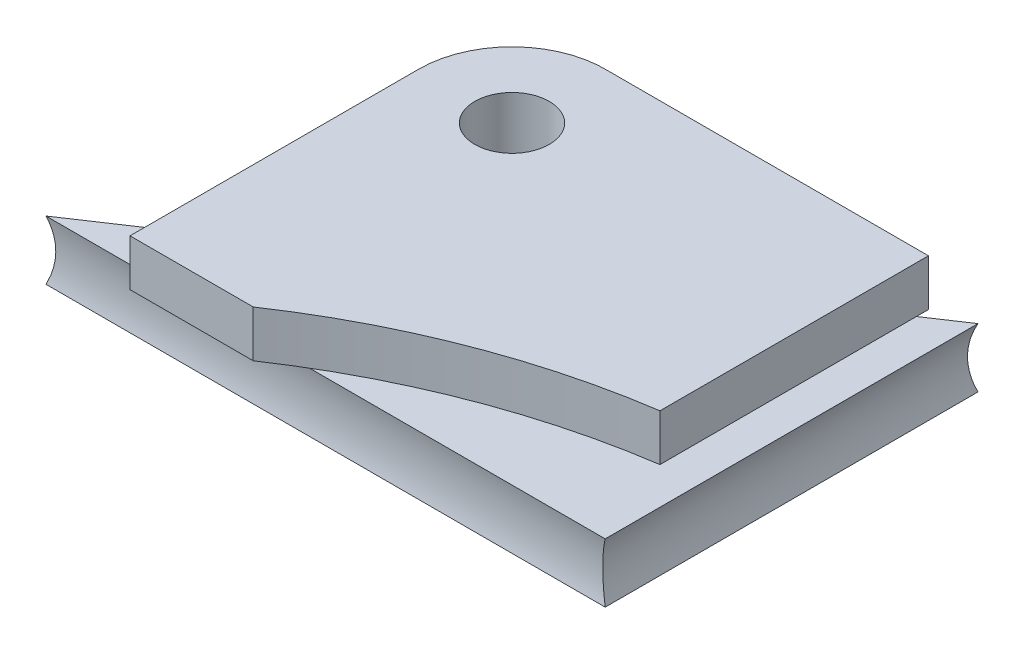
ISO-10303-21;
HEADER;
FILE_DESCRIPTION(('STEP AP214'),'2;1');
FILE_NAME('part.step','',(''),(''),'','','');
FILE_SCHEMA(('AUTOMOTIVE_DESIGN { 1 0 10303 214 1 1 1 1 }'));
ENDSEC;
DATA;
#1=APPLICATION_CONTEXT('core data for automotive mechanical design processes');
#2=APPLICATION_PROTOCOL_DEFINITION('international standard','automotive_design',2000,#1);
#3=PRODUCT_CONTEXT('',#1,'mechanical');
#4=PRODUCT('Part','Part','',(#3));
#5=PRODUCT_RELATED_PRODUCT_CATEGORY('part','',(#4));
#6=PRODUCT_DEFINITION_FORMATION('','',#4);
#7=PRODUCT_DEFINITION_CONTEXT('part definition',#1,'design');
#8=PRODUCT_DEFINITION('design','',#6,#7);
#9=PRODUCT_DEFINITION_SHAPE('','',#8);
#10=(LENGTH_UNIT() NAMED_UNIT(*) SI_UNIT(.MILLI.,.METRE.));
#11=(NAMED_UNIT(*) PLANE_ANGLE_UNIT() SI_UNIT($,.RADIAN.));
#12=(NAMED_UNIT(*) SI_UNIT($,.STERADIAN.) SOLID_ANGLE_UNIT());
#13=UNCERTAINTY_MEASURE_WITH_UNIT(LENGTH_MEASURE(1.E-05),#10,'distance_accuracy_value','');
#14=(GEOMETRIC_REPRESENTATION_CONTEXT(3) GLOBAL_UNCERTAINTY_ASSIGNED_CONTEXT((#13)) GLOBAL_UNIT_ASSIGNED_CONTEXT((#10,
#11,#12)) REPRESENTATION_CONTEXT('',''));
#15=CARTESIAN_POINT('',(0.,0.,0.));
#16=DIRECTION('',(0.,0.,1.));
#17=DIRECTION('',(1.,0.,0.));
#18=AXIS2_PLACEMENT_3D('',#15,#16,#17);
#19=CARTESIAN_POINT('',(0.,20.,0.));
#20=DIRECTION('',(0.,-1.,0.));
#21=DIRECTION('',(0.,0.,-1.));
#22=AXIS2_PLACEMENT_3D('',#19,#20,#21);
#23=CYLINDRICAL_SURFACE('',#22,10.);
#24=CARTESIAN_POINT('',(0.,0.,0.));
#25=DIRECTION('',(0.,1.,0.));
#26=DIRECTION('',(0.,0.,1.));
#27=AXIS2_PLACEMENT_3D('',#24,#25,#26);
#28=CIRCLE('',#27,10.);
#29=CARTESIAN_POINT('',(8.32050294337846,0.,-5.54700196225231));
#30=VERTEX_POINT('',#29);
#31=CARTESIAN_POINT('',(-8.32050294337846,0.,5.54700196225231));
#32=VERTEX_POINT('',#31);
#33=EDGE_CURVE('E66',#30,#32,#28,.T.);
#34=ORIENTED_EDGE('',*,*,#33,.T.);
#35=DIRECTION('',(0.,-1.,0.));
#36=VECTOR('',#35,1.);
#37=CARTESIAN_POINT('',(-8.32050294337846,6.35,5.54700196225231));
#38=LINE('',#37,#36);
#39=CARTESIAN_POINT('',(-8.32050294337846,6.35,5.54700196225231));
#40=VERTEX_POINT('',#39);
#41=EDGE_CURVE('E51',#40,#32,#38,.T.);
#42=ORIENTED_EDGE('',*,*,#41,.F.);
#43=CARTESIAN_POINT('',(0.,6.35,0.));
#44=DIRECTION('',(0.,1.,0.));
#45=DIRECTION('',(0.,0.,1.));
#46=AXIS2_PLACEMENT_3D('',#43,#44,#45);
#47=CIRCLE('',#46,10.);
#48=CARTESIAN_POINT('',(8.32050294337846,6.35,-5.54700196225231));
#49=VERTEX_POINT('',#48);
#50=EDGE_CURVE('E195',#40,#49,#47,.T.);
#51=ORIENTED_EDGE('',*,*,#50,.T.);
#52=DIRECTION('',(0.,-1.,0.));
#53=VECTOR('',#52,1.);
#54=CARTESIAN_POINT('',(8.32050294337846,6.35,-5.54700196225231));
#55=LINE('',#54,#53);
#56=EDGE_CURVE('E215',#49,#30,#55,.T.);
#57=ORIENTED_EDGE('',*,*,#56,.T.);
#58=EDGE_LOOP('',(#34,#42,#51,#57));
#59=FACE_BOUND('',#58,.T.);
#60=DIRECTION('',(0.,1.,0.));
#61=VECTOR('',#60,1.);
#62=CARTESIAN_POINT('',(-10.,15.,0.));
#63=LINE('',#62,#61);
#64=CARTESIAN_POINT('',(-10.,15.,0.));
#65=VERTEX_POINT('',#64);
#66=CARTESIAN_POINT('',(-10.,20.,0.));
#67=VERTEX_POINT('',#66);
#68=EDGE_CURVE('E172',#65,#67,#63,.T.);
#69=ORIENTED_EDGE('',*,*,#68,.T.);
#70=CARTESIAN_POINT('',(0.,20.,0.));
#71=DIRECTION('',(0.,1.,0.));
#72=DIRECTION('',(0.,0.,1.));
#73=AXIS2_PLACEMENT_3D('',#70,#71,#72);
#74=CIRCLE('',#73,10.);
#75=CARTESIAN_POINT('',(0.311636816918556,20.,-9.995142945168));
#76=VERTEX_POINT('',#75);
#77=EDGE_CURVE('E189',#76,#67,#74,.T.);
#78=ORIENTED_EDGE('',*,*,#77,.F.);
#79=DIRECTION('',(0.,1.,0.));
#80=VECTOR('',#79,1.);
#81=CARTESIAN_POINT('',(0.311636816918556,15.,-9.995142945168));
#82=LINE('',#81,#80);
#83=CARTESIAN_POINT('',(0.311636816918556,15.,-9.995142945168));
#84=VERTEX_POINT('',#83);
#85=EDGE_CURVE('E175',#84,#76,#82,.T.);
#86=ORIENTED_EDGE('',*,*,#85,.F.);
#87=CARTESIAN_POINT('',(0.,15.,0.));
#88=DIRECTION('',(0.,1.,0.));
#89=DIRECTION('',(0.,0.,1.));
#90=AXIS2_PLACEMENT_3D('',#87,#88,#89);
#91=CIRCLE('',#90,10.);
#92=EDGE_CURVE('E160',#65,#84,#91,.T.);
#93=ORIENTED_EDGE('',*,*,#92,.F.);
#94=EDGE_LOOP('',(#69,#78,#86,#93));
#95=FACE_BOUND('',#94,.T.);
#96=ADVANCED_FACE('F37',(#59,#95),#23,.T.);
#97=CARTESIAN_POINT('',(0.,6.35,0.));
#98=DIRECTION('',(0.554700196225229,0.,0.832050294337844));
#99=DIRECTION('',(0.832050294337844,0.,-0.554700196225229));
#100=AXIS2_PLACEMENT_3D('',#97,#98,#99);
#101=PLANE('',#100);
#102=CARTESIAN_POINT('',(-47.7058045929883,3.175,31.8038697286589));
#103=DIRECTION('',(0.554700196225229,0.,0.832050294337844));
#104=DIRECTION('',(-0.832050294337844,0.,0.554700196225229));
#105=AXIS2_PLACEMENT_3D('',#102,#103,#104);
#106=ELLIPSE('',#105,22.0360815052548,12.223418735);
#107=CARTESIAN_POINT('',(-30.,6.35,20.));
#108=VERTEX_POINT('',#107);
#109=CARTESIAN_POINT('',(-30.,0.,20.));
#110=VERTEX_POINT('',#109);
#111=EDGE_CURVE('E171',#108,#110,#106,.F.);
#112=ORIENTED_EDGE('',*,*,#111,.F.);
#113=DIRECTION('',(-0.832050294337844,0.,0.554700196225229));
#114=VECTOR('',#113,1.);
#115=CARTESIAN_POINT('',(0.,6.35,0.));
#116=LINE('',#115,#114);
#117=EDGE_CURVE('E197',#40,#108,#116,.T.);
#118=ORIENTED_EDGE('',*,*,#117,.F.);
#119=ORIENTED_EDGE('',*,*,#41,.T.);
#120=DIRECTION('',(-0.832050294337844,0.,0.554700196225229));
#121=VECTOR('',#120,1.);
#122=CARTESIAN_POINT('',(0.,0.,0.));
#123=LINE('',#122,#121);
#124=EDGE_CURVE('E191',#32,#110,#123,.T.);
#125=ORIENTED_EDGE('',*,*,#124,.T.);
#126=EDGE_LOOP('',(#112,#118,#119,#125));
#127=FACE_BOUND('',#126,.T.);
#128=ADVANCED_FACE('F220',(#127),#101,.F.);
#129=CARTESIAN_POINT('',(37.0900527294136,3.175,-20.));
#130=DIRECTION('',(0.,0.,1.));
#131=DIRECTION('',(1.,0.,0.));
#132=AXIS2_PLACEMENT_3D('',#129,#130,#131);
#133=CYLINDRICAL_SURFACE('',#132,7.76849230583803);
#134=CARTESIAN_POINT('',(30.,0.,20.));
#135=CARTESIAN_POINT('',(29.9239765513835,0.169720523927249,19.9543241050853));
#136=CARTESIAN_POINT('',(29.8537588486212,0.342908032310501,19.9116895488122));
#137=CARTESIAN_POINT('',(29.7255504774872,0.695346204377056,19.8332500078259));
#138=CARTESIAN_POINT('',(29.6675658304693,0.874599803773515,19.7974483872426));
#139=CARTESIAN_POINT('',(29.564597430156,1.23784017766062,19.7335191237629));
#140=CARTESIAN_POINT('',(29.51959304007,1.4218189268894,19.7053793037096));
#141=CARTESIAN_POINT('',(29.4430173715659,1.79357817697413,19.6573168050165));
#142=CARTESIAN_POINT('',(29.4114435741575,1.9813579579959,19.6373925855119));
#143=CARTESIAN_POINT('',(29.3620414439221,2.36017547619931,19.6061533726255));
#144=CARTESIAN_POINT('',(29.3442665935945,2.55122298537353,19.5948718792609));
#145=CARTESIAN_POINT('',(29.3229155488335,2.93442696800272,19.5813150018964));
#146=CARTESIAN_POINT('',(29.3193390294853,3.12658341597995,19.5790394118053));
#147=CARTESIAN_POINT('',(29.3264342913606,3.51049820428034,19.5835482472296));
#148=CARTESIAN_POINT('',(29.3371041795205,3.70225659410656,19.5903314690095));
#149=CARTESIAN_POINT('',(29.3725360490202,4.08391762352589,19.6127923203084));
#150=CARTESIAN_POINT('',(29.3972962107904,4.2738204995135,19.6284688013815));
#151=CARTESIAN_POINT('',(29.4565303053951,4.62640542232356,19.6658014122365));
#152=CARTESIAN_POINT('',(29.4893658424432,4.78947447484862,19.6864419253335));
#153=CARTESIAN_POINT('',(29.5651799113299,5.1123327316866,19.7338518658458));
#154=CARTESIAN_POINT('',(29.6081585927966,5.27212188757786,19.760621383674));
#155=CARTESIAN_POINT('',(29.7038857388481,5.58771726043739,19.8198582811779));
#156=CARTESIAN_POINT('',(29.7566376859372,5.74352203506026,19.8523276916774));
#157=CARTESIAN_POINT('',(29.8714483005509,6.0504305807242,19.9224253358323));
#158=CARTESIAN_POINT('',(29.9335046542857,6.20153550925952,19.9600522867282));
#159=CARTESIAN_POINT('',(30.,6.35,20.));
#160=B_SPLINE_CURVE_WITH_KNOTS('',3,(#134,#135,#136,#137,#138,#139,#140,#141,#142,#143,#144,
#145,#146,#147,#148,#149,#150,#151,#152,#153,#154,#155,#156,#157,#158,#159),.UNSPECIFIED.,.F.,
.F.,(4,2,2,2,2,2,2,2,2,2,2,2,4),(0.,0.574411087071994,1.14910425444714,1.72287863916665,
2.29654536147595,2.87242457430372,3.44829060863177,4.02408012946255,4.59979531167572,
5.10220084958724,5.60461379927068,6.10720611911273,6.60967366257729),.UNSPECIFIED.);
#161=CARTESIAN_POINT('',(30.,0.,20.));
#162=VERTEX_POINT('',#161);
#163=CARTESIAN_POINT('',(30.,6.35,20.));
#164=VERTEX_POINT('',#163);
#165=EDGE_CURVE('E11',#162,#164,#160,.T.);
#166=ORIENTED_EDGE('',*,*,#165,.F.);
#167=DIRECTION('',(0.,0.,1.));
#168=VECTOR('',#167,1.);
#169=CARTESIAN_POINT('',(30.,0.,0.));
#170=LINE('',#169,#168);
#171=CARTESIAN_POINT('',(30.,0.,-20.));
#172=VERTEX_POINT('',#171);
#173=EDGE_CURVE('E212',#172,#162,#170,.T.);
#174=ORIENTED_EDGE('',*,*,#173,.F.);
#175=CARTESIAN_POINT('',(37.0900527294136,3.175,-24.726701819609));
#176=DIRECTION('',(0.554700196225229,0.,0.832050294337844));
#177=DIRECTION('',(-0.832050294337844,0.,0.554700196225229));
#178=AXIS2_PLACEMENT_3D('',#175,#176,#177);
#179=ELLIPSE('',#178,9.33656578058216,7.76849230583803);
#180=CARTESIAN_POINT('',(30.,6.35,-20.));
#181=VERTEX_POINT('',#180);
#182=EDGE_CURVE('E182',#181,#172,#179,.T.);
#183=ORIENTED_EDGE('',*,*,#182,.F.);
#184=DIRECTION('',(0.,0.,1.));
#185=VECTOR('',#184,1.);
#186=CARTESIAN_POINT('',(30.,6.35,0.));
#187=LINE('',#186,#185);
#188=EDGE_CURVE('E204',#181,#164,#187,.T.);
#189=ORIENTED_EDGE('',*,*,#188,.T.);
#190=EDGE_LOOP('',(#166,#174,#183,#189));
#191=FACE_BOUND('',#190,.T.);
#192=ADVANCED_FACE('F229',(#191),#133,.F.);
#193=EDGE_CURVE('E202',#181,#49,#116,.T.);
#194=ORIENTED_EDGE('',*,*,#193,.F.);
#195=ORIENTED_EDGE('',*,*,#182,.T.);
#196=EDGE_CURVE('E198',#172,#30,#123,.T.);
#197=ORIENTED_EDGE('',*,*,#196,.T.);
#198=ORIENTED_EDGE('',*,*,#56,.F.);
#199=EDGE_LOOP('',(#194,#195,#197,#198));
#200=FACE_BOUND('',#199,.T.);
#201=ADVANCED_FACE('F39',(#200),#101,.F.);
#202=CARTESIAN_POINT('',(0.,6.35,0.));
#203=DIRECTION('',(0.,1.,0.));
#204=DIRECTION('',(0.,0.,1.));
#205=AXIS2_PLACEMENT_3D('',#202,#203,#204);
#206=PLANE('',#205);
#207=ORIENTED_EDGE('',*,*,#50,.F.);
#208=ORIENTED_EDGE('',*,*,#117,.T.);
#209=DIRECTION('',(-1.,0.,0.));
#210=VECTOR('',#209,1.);
#211=CARTESIAN_POINT('',(0.,6.35,20.));
#212=LINE('',#211,#210);
#213=EDGE_CURVE('E201',#164,#108,#212,.T.);
#214=ORIENTED_EDGE('',*,*,#213,.F.);
#215=ORIENTED_EDGE('',*,*,#188,.F.);
#216=ORIENTED_EDGE('',*,*,#193,.T.);
#217=EDGE_LOOP('',(#207,#208,#214,#215,#216));
#218=FACE_BOUND('',#217,.T.);
#219=ADVANCED_FACE('F235',(#218),#206,.T.);
#220=CARTESIAN_POINT('',(0.,0.,0.));
#221=DIRECTION('',(0.,1.,0.));
#222=DIRECTION('',(0.,0.,1.));
#223=AXIS2_PLACEMENT_3D('',#220,#221,#222);
#224=PLANE('',#223);
#225=ORIENTED_EDGE('',*,*,#124,.F.);
#226=ORIENTED_EDGE('',*,*,#33,.F.);
#227=ORIENTED_EDGE('',*,*,#196,.F.);
#228=ORIENTED_EDGE('',*,*,#173,.T.);
#229=DIRECTION('',(-1.,0.,0.));
#230=VECTOR('',#229,1.);
#231=CARTESIAN_POINT('',(0.,0.,20.));
#232=LINE('',#231,#230);
#233=EDGE_CURVE('E209',#162,#110,#232,.T.);
#234=ORIENTED_EDGE('',*,*,#233,.T.);
#235=EDGE_LOOP('',(#225,#226,#227,#228,#234));
#236=FACE_BOUND('',#235,.T.);
#237=CARTESIAN_POINT('',(0.,0.,0.));
#238=DIRECTION('',(0.,1.,0.));
#239=DIRECTION('',(0.,0.,1.));
#240=AXIS2_PLACEMENT_3D('',#237,#238,#239);
#241=CIRCLE('',#240,4.00000000000003);
#242=CARTESIAN_POINT('',(0.,0.,4.00000000000002));
#243=VERTEX_POINT('',#242);
#244=EDGE_CURVE('E185',#243,#243,#241,.T.);
#245=ORIENTED_EDGE('',*,*,#244,.T.);
#246=EDGE_LOOP('',(#245));
#247=FACE_BOUND('',#246,.T.);
#248=ADVANCED_FACE('F223',(#236,#247),#224,.F.);
#249=CARTESIAN_POINT('',(0.,20.,0.));
#250=DIRECTION('',(0.,-1.,0.));
#251=DIRECTION('',(0.,0.,-1.));
#252=AXIS2_PLACEMENT_3D('',#249,#250,#251);
#253=CYLINDRICAL_SURFACE('',#252,4.00000000000003);
#254=CARTESIAN_POINT('',(0.,20.,0.));
#255=DIRECTION('',(0.,1.,0.));
#256=DIRECTION('',(0.,0.,1.));
#257=AXIS2_PLACEMENT_3D('',#254,#255,#256);
#258=CIRCLE('',#257,4.00000000000003);
#259=CARTESIAN_POINT('',(0.,20.,4.00000000000002));
#260=VERTEX_POINT('',#259);
#261=EDGE_CURVE('E186',#260,#260,#258,.T.);
#262=ORIENTED_EDGE('',*,*,#261,.T.);
#263=EDGE_LOOP('',(#262));
#264=FACE_BOUND('',#263,.T.);
#265=ORIENTED_EDGE('',*,*,#244,.F.);
#266=EDGE_LOOP('',(#265));
#267=FACE_BOUND('',#266,.T.);
#268=ADVANCED_FACE('F256',(#264,#267),#253,.F.);
#269=CARTESIAN_POINT('',(0.,20.,0.));
#270=DIRECTION('',(0.,1.,0.));
#271=DIRECTION('',(0.,0.,1.));
#272=AXIS2_PLACEMENT_3D('',#269,#270,#271);
#273=PLANE('',#272);
#274=ORIENTED_EDGE('',*,*,#261,.F.);
#275=EDGE_LOOP('',(#274));
#276=FACE_BOUND('',#275,.T.);
#277=ORIENTED_EDGE('',*,*,#77,.T.);
#278=DIRECTION('',(0.,0.,1.));
#279=VECTOR('',#278,1.);
#280=CARTESIAN_POINT('',(-10.,20.,0.));
#281=LINE('',#280,#279);
#282=CARTESIAN_POINT('',(-10.,20.,30.9857140071963));
#283=VERTEX_POINT('',#282);
#284=EDGE_CURVE('E152',#67,#283,#281,.T.);
#285=ORIENTED_EDGE('',*,*,#284,.T.);
#286=DIRECTION('',(1.,0.,0.));
#287=VECTOR('',#286,1.);
#288=CARTESIAN_POINT('',(0.,20.,30.9857140071963));
#289=LINE('',#288,#287);
#290=CARTESIAN_POINT('',(3.22237087577426,20.,30.9857140071963));
#291=VERTEX_POINT('',#290);
#292=EDGE_CURVE('E163',#283,#291,#289,.T.);
#293=ORIENTED_EDGE('',*,*,#292,.T.);
#294=CARTESIAN_POINT('',(45.7215152057399,20.,94.092546683966));
#295=DIRECTION('',(0.,1.,0.));
#296=DIRECTION('',(0.,0.,1.));
#297=AXIS2_PLACEMENT_3D('',#294,#295,#296);
#298=CIRCLE('',#297,76.0831755335768);
#299=CARTESIAN_POINT('',(34.6883631830815,20.,18.8136043712716));
#300=VERTEX_POINT('',#299);
#301=EDGE_CURVE('E132',#291,#300,#298,.F.);
#302=ORIENTED_EDGE('',*,*,#301,.T.);
#303=DIRECTION('',(0.,0.,1.));
#304=VECTOR('',#303,1.);
#305=CARTESIAN_POINT('',(34.6883631830815,20.,0.));
#306=LINE('',#305,#304);
#307=CARTESIAN_POINT('',(34.6883631830815,20.,-9.995142945168));
#308=VERTEX_POINT('',#307);
#309=EDGE_CURVE('E166',#308,#300,#306,.T.);
#310=ORIENTED_EDGE('',*,*,#309,.F.);
#311=DIRECTION('',(1.,0.,0.));
#312=VECTOR('',#311,1.);
#313=CARTESIAN_POINT('',(0.,20.,-9.995142945168));
#314=LINE('',#313,#312);
#315=EDGE_CURVE('E58',#76,#308,#314,.T.);
#316=ORIENTED_EDGE('',*,*,#315,.F.);
#317=EDGE_LOOP('',(#277,#285,#293,#302,#310,#316));
#318=FACE_BOUND('',#317,.T.);
#319=ADVANCED_FACE('F255',(#276,#318),#273,.T.);
#320=CARTESIAN_POINT('',(30.,3.175,31.8038697286589));
#321=DIRECTION('',(-1.,0.,0.));
#322=DIRECTION('',(0.,0.,1.));
#323=AXIS2_PLACEMENT_3D('',#320,#321,#322);
#324=CYLINDRICAL_SURFACE('',#323,12.223418735);
#325=ORIENTED_EDGE('',*,*,#111,.T.);
#326=ORIENTED_EDGE('',*,*,#233,.F.);
#327=ORIENTED_EDGE('',*,*,#165,.T.);
#328=ORIENTED_EDGE('',*,*,#213,.T.);
#329=EDGE_LOOP('',(#325,#326,#327,#328));
#330=FACE_BOUND('',#329,.T.);
#331=ADVANCED_FACE('F227',(#330),#324,.F.);
#332=CARTESIAN_POINT('',(0.,15.,30.9857140071963));
#333=DIRECTION('',(0.,0.,1.));
#334=DIRECTION('',(1.,0.,0.));
#335=AXIS2_PLACEMENT_3D('',#332,#333,#334);
#336=PLANE('',#335);
#337=ORIENTED_EDGE('',*,*,#292,.F.);
#338=DIRECTION('',(0.,1.,0.));
#339=VECTOR('',#338,1.);
#340=CARTESIAN_POINT('',(-10.,15.,30.9857140071963));
#341=LINE('',#340,#339);
#342=CARTESIAN_POINT('',(-10.,15.,30.9857140071963));
#343=VERTEX_POINT('',#342);
#344=EDGE_CURVE('E151',#343,#283,#341,.T.);
#345=ORIENTED_EDGE('',*,*,#344,.F.);
#346=DIRECTION('',(1.,0.,0.));
#347=VECTOR('',#346,1.);
#348=CARTESIAN_POINT('',(0.,15.,30.9857140071963));
#349=LINE('',#348,#347);
#350=CARTESIAN_POINT('',(3.22237087577426,15.,30.9857140071963));
#351=VERTEX_POINT('',#350);
#352=EDGE_CURVE('E144',#343,#351,#349,.T.);
#353=ORIENTED_EDGE('',*,*,#352,.T.);
#354=DIRECTION('',(0.,1.,0.));
#355=VECTOR('',#354,1.);
#356=CARTESIAN_POINT('',(3.22237087577426,15.,30.9857140071963));
#357=LINE('',#356,#355);
#358=EDGE_CURVE('E127',#351,#291,#357,.T.);
#359=ORIENTED_EDGE('',*,*,#358,.T.);
#360=EDGE_LOOP('',(#337,#345,#353,#359));
#361=FACE_BOUND('',#360,.T.);
#362=ADVANCED_FACE('F150',(#361),#336,.T.);
#363=CARTESIAN_POINT('',(-10.,15.,0.));
#364=DIRECTION('',(-1.,0.,0.));
#365=DIRECTION('',(0.,0.,1.));
#366=AXIS2_PLACEMENT_3D('',#363,#364,#365);
#367=PLANE('',#366);
#368=ORIENTED_EDGE('',*,*,#284,.F.);
#369=ORIENTED_EDGE('',*,*,#68,.F.);
#370=DIRECTION('',(0.,0.,1.));
#371=VECTOR('',#370,1.);
#372=CARTESIAN_POINT('',(-10.,15.,0.));
#373=LINE('',#372,#371);
#374=EDGE_CURVE('E138',#65,#343,#373,.T.);
#375=ORIENTED_EDGE('',*,*,#374,.T.);
#376=ORIENTED_EDGE('',*,*,#344,.T.);
#377=EDGE_LOOP('',(#368,#369,#375,#376));
#378=FACE_BOUND('',#377,.T.);
#379=ADVANCED_FACE('F287',(#378),#367,.T.);
#380=CARTESIAN_POINT('',(0.,15.,-9.995142945168));
#381=DIRECTION('',(0.,0.,1.));
#382=DIRECTION('',(1.,0.,0.));
#383=AXIS2_PLACEMENT_3D('',#380,#381,#382);
#384=PLANE('',#383);
#385=ORIENTED_EDGE('',*,*,#315,.T.);
#386=DIRECTION('',(0.,1.,0.));
#387=VECTOR('',#386,1.);
#388=CARTESIAN_POINT('',(34.6883631830815,15.,-9.995142945168));
#389=LINE('',#388,#387);
#390=CARTESIAN_POINT('',(34.6883631830815,15.,-9.995142945168));
#391=VERTEX_POINT('',#390);
#392=EDGE_CURVE('E177',#391,#308,#389,.T.);
#393=ORIENTED_EDGE('',*,*,#392,.F.);
#394=DIRECTION('',(1.,0.,0.));
#395=VECTOR('',#394,1.);
#396=CARTESIAN_POINT('',(0.,15.,-9.995142945168));
#397=LINE('',#396,#395);
#398=EDGE_CURVE('E158',#84,#391,#397,.T.);
#399=ORIENTED_EDGE('',*,*,#398,.F.);
#400=ORIENTED_EDGE('',*,*,#85,.T.);
#401=EDGE_LOOP('',(#385,#393,#399,#400));
#402=FACE_BOUND('',#401,.T.);
#403=ADVANCED_FACE('F294',(#402),#384,.F.);
#404=CARTESIAN_POINT('',(34.6883631830815,15.,0.));
#405=DIRECTION('',(-1.,0.,0.));
#406=DIRECTION('',(0.,0.,1.));
#407=AXIS2_PLACEMENT_3D('',#404,#405,#406);
#408=PLANE('',#407);
#409=ORIENTED_EDGE('',*,*,#309,.T.);
#410=DIRECTION('',(0.,1.,0.));
#411=VECTOR('',#410,1.);
#412=CARTESIAN_POINT('',(34.6883631830815,15.,18.8136043712716));
#413=LINE('',#412,#411);
#414=CARTESIAN_POINT('',(34.6883631830815,15.,18.8136043712716));
#415=VERTEX_POINT('',#414);
#416=EDGE_CURVE('E137',#415,#300,#413,.T.);
#417=ORIENTED_EDGE('',*,*,#416,.F.);
#418=DIRECTION('',(0.,0.,1.));
#419=VECTOR('',#418,1.);
#420=CARTESIAN_POINT('',(34.6883631830815,15.,0.));
#421=LINE('',#420,#419);
#422=EDGE_CURVE('E147',#391,#415,#421,.T.);
#423=ORIENTED_EDGE('',*,*,#422,.F.);
#424=ORIENTED_EDGE('',*,*,#392,.T.);
#425=EDGE_LOOP('',(#409,#417,#423,#424));
#426=FACE_BOUND('',#425,.T.);
#427=ADVANCED_FACE('F302',(#426),#408,.F.);
#428=CARTESIAN_POINT('',(45.7215152057399,15.,94.092546683966));
#429=DIRECTION('',(0.,1.,0.));
#430=DIRECTION('',(0.,0.,1.));
#431=AXIS2_PLACEMENT_3D('',#428,#429,#430);
#432=CYLINDRICAL_SURFACE('',#431,76.0831755335768);
#433=ORIENTED_EDGE('',*,*,#301,.F.);
#434=ORIENTED_EDGE('',*,*,#358,.F.);
#435=CARTESIAN_POINT('',(45.7215152057399,15.,94.092546683966));
#436=DIRECTION('',(0.,1.,0.));
#437=DIRECTION('',(0.,0.,1.));
#438=AXIS2_PLACEMENT_3D('',#435,#436,#437);
#439=CIRCLE('',#438,76.0831755335768);
#440=EDGE_CURVE('E130',#351,#415,#439,.F.);
#441=ORIENTED_EDGE('',*,*,#440,.T.);
#442=ORIENTED_EDGE('',*,*,#416,.T.);
#443=EDGE_LOOP('',(#433,#434,#441,#442));
#444=FACE_BOUND('',#443,.T.);
#445=ADVANCED_FACE('F129',(#444),#432,.F.);
#446=CARTESIAN_POINT('',(0.,15.,0.));
#447=DIRECTION('',(0.,1.,0.));
#448=DIRECTION('',(0.,0.,1.));
#449=AXIS2_PLACEMENT_3D('',#446,#447,#448);
#450=PLANE('',#449);
#451=ORIENTED_EDGE('',*,*,#352,.F.);
#452=ORIENTED_EDGE('',*,*,#374,.F.);
#453=ORIENTED_EDGE('',*,*,#92,.T.);
#454=ORIENTED_EDGE('',*,*,#398,.T.);
#455=ORIENTED_EDGE('',*,*,#422,.T.);
#456=ORIENTED_EDGE('',*,*,#440,.F.);
#457=EDGE_LOOP('',(#451,#452,#453,#454,#455,#456));
#458=FACE_BOUND('',#457,.T.);
#459=ADVANCED_FACE('F142',(#458),#450,.F.);
#460=CLOSED_SHELL('',(#96,#128,#192,#201,#219,#248,#268,#319,#331,#362,#379,#403,#427,#445,#459));
#461=MANIFOLD_SOLID_BREP('B2',#460);
#462=ADVANCED_BREP_SHAPE_REPRESENTATION('',(#18,#461),#14);
#463=SHAPE_DEFINITION_REPRESENTATION(#9,#462);
ENDSEC;
END-ISO-10303-21;
